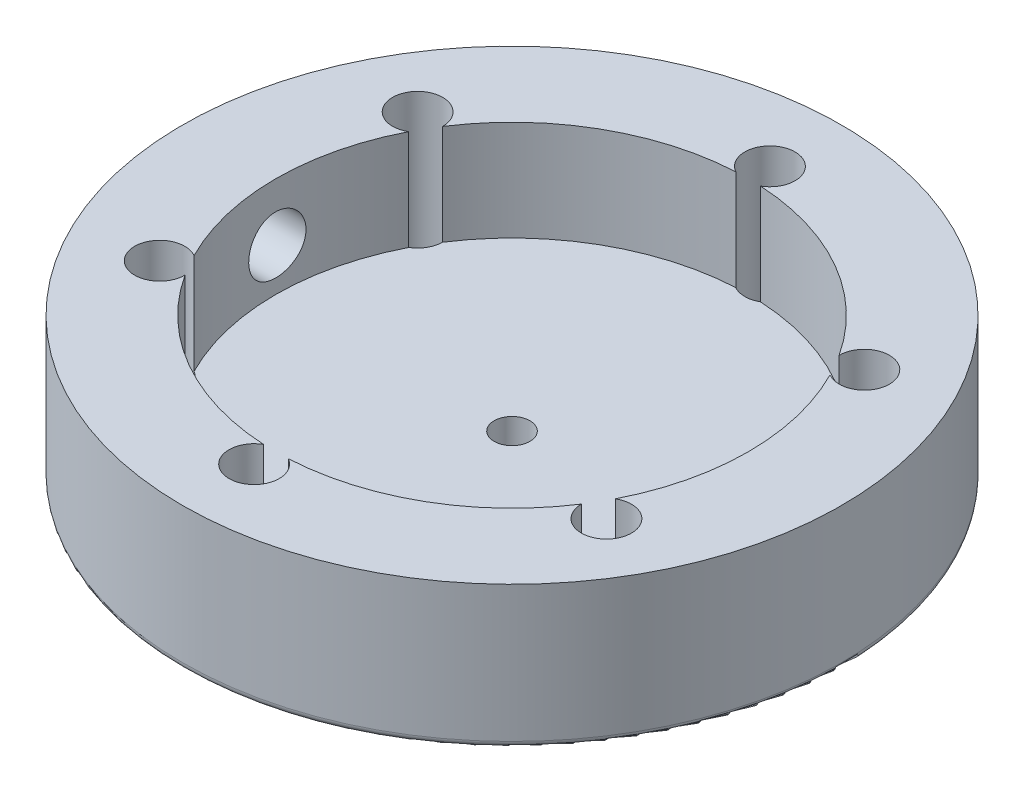
ISO-10303-21;
HEADER;
FILE_DESCRIPTION(('STEP AP214'),'2;1');
FILE_NAME('part.step','',(''),(''),'','','');
FILE_SCHEMA(('AUTOMOTIVE_DESIGN { 1 0 10303 214 1 1 1 1 }'));
ENDSEC;
DATA;
#1=APPLICATION_CONTEXT('core data for automotive mechanical design processes');
#2=APPLICATION_PROTOCOL_DEFINITION('international standard','automotive_design',2000,#1);
#3=PRODUCT_CONTEXT('',#1,'mechanical');
#4=PRODUCT('Part','Part','',(#3));
#5=PRODUCT_RELATED_PRODUCT_CATEGORY('part','',(#4));
#6=PRODUCT_DEFINITION_FORMATION('','',#4);
#7=PRODUCT_DEFINITION_CONTEXT('part definition',#1,'design');
#8=PRODUCT_DEFINITION('design','',#6,#7);
#9=PRODUCT_DEFINITION_SHAPE('','',#8);
#10=(LENGTH_UNIT() NAMED_UNIT(*) SI_UNIT(.MILLI.,.METRE.));
#11=(NAMED_UNIT(*) PLANE_ANGLE_UNIT() SI_UNIT($,.RADIAN.));
#12=(NAMED_UNIT(*) SI_UNIT($,.STERADIAN.) SOLID_ANGLE_UNIT());
#13=UNCERTAINTY_MEASURE_WITH_UNIT(LENGTH_MEASURE(1.E-05),#10,'distance_accuracy_value','');
#14=(GEOMETRIC_REPRESENTATION_CONTEXT(3) GLOBAL_UNCERTAINTY_ASSIGNED_CONTEXT((#13)) GLOBAL_UNIT_ASSIGNED_CONTEXT((#10,
#11,#12)) REPRESENTATION_CONTEXT('',''));
#15=CARTESIAN_POINT('',(0.,0.,0.));
#16=DIRECTION('',(0.,0.,1.));
#17=DIRECTION('',(1.,0.,0.));
#18=AXIS2_PLACEMENT_3D('',#15,#16,#17);
#19=CARTESIAN_POINT('',(0.,20.,0.));
#20=DIRECTION('',(0.,1.,0.));
#21=DIRECTION('',(0.,0.,1.));
#22=AXIS2_PLACEMENT_3D('',#19,#20,#21);
#23=PLANE('',#22);
#24=CARTESIAN_POINT('',(0.,20.,0.));
#25=DIRECTION('',(0.,1.,0.));
#26=DIRECTION('',(0.,0.,1.));
#27=AXIS2_PLACEMENT_3D('',#24,#25,#26);
#28=CIRCLE('',#27,33.);
#29=CARTESIAN_POINT('',(1.72543592967507,20.,32.9548611111105));
#30=VERTEX_POINT('',#29);
#31=CARTESIAN_POINT('',(27.6770289355777,20.,17.9717019032477));
#32=VERTEX_POINT('',#31);
#33=EDGE_CURVE('E150',#30,#32,#28,.T.);
#34=ORIENTED_EDGE('',*,*,#33,.F.);
#35=CARTESIAN_POINT('',(4.4102734525994E-12,20.,36.));
#36=DIRECTION('',(0.,1.,0.));
#37=DIRECTION('',(0.,0.,1.));
#38=AXIS2_PLACEMENT_3D('',#35,#36,#37);
#39=CIRCLE('',#38,3.50000000000354);
#40=CARTESIAN_POINT('',(-1.72543592966699,20.,32.954861111111));
#41=VERTEX_POINT('',#40);
#42=EDGE_CURVE('E165',#41,#30,#39,.T.);
#43=ORIENTED_EDGE('',*,*,#42,.F.);
#44=CARTESIAN_POINT('',(-27.677028935571,20.,17.971701903258));
#45=VERTEX_POINT('',#44);
#46=EDGE_CURVE('E173',#45,#41,#28,.T.);
#47=ORIENTED_EDGE('',*,*,#46,.F.);
#48=CARTESIAN_POINT('',(-31.1769145362365,20.,18.0000000000019));
#49=DIRECTION('',(0.,1.,0.));
#50=DIRECTION('',(0.,0.,1.));
#51=AXIS2_PLACEMENT_3D('',#48,#49,#50);
#52=CIRCLE('',#51,3.50000000000354);
#53=CARTESIAN_POINT('',(-29.4024648652453,20.,14.9831592078579));
#54=VERTEX_POINT('',#53);
#55=EDGE_CURVE('E183',#54,#45,#52,.T.);
#56=ORIENTED_EDGE('',*,*,#55,.F.);
#57=CARTESIAN_POINT('',(-29.4024648652471,20.,-14.9831592078543));
#58=VERTEX_POINT('',#57);
#59=EDGE_CURVE('E411',#58,#54,#28,.T.);
#60=ORIENTED_EDGE('',*,*,#59,.F.);
#61=CARTESIAN_POINT('',(-31.1769145362387,20.,-17.9999999999981));
#62=DIRECTION('',(0.,1.,0.));
#63=DIRECTION('',(0.,0.,1.));
#64=AXIS2_PLACEMENT_3D('',#61,#62,#63);
#65=CIRCLE('',#64,3.50000000000354);
#66=CARTESIAN_POINT('',(-27.6770289355732,20.,-17.9717019032546));
#67=VERTEX_POINT('',#66);
#68=EDGE_CURVE('E195',#67,#58,#65,.T.);
#69=ORIENTED_EDGE('',*,*,#68,.F.);
#70=CARTESIAN_POINT('',(-1.72543592967103,20.,-32.9548611111108));
#71=VERTEX_POINT('',#70);
#72=EDGE_CURVE('E406',#71,#67,#28,.T.);
#73=ORIENTED_EDGE('',*,*,#72,.F.);
#74=CARTESIAN_POINT('',(0.,20.,-36.));
#75=DIRECTION('',(0.,1.,0.));
#76=DIRECTION('',(0.,0.,1.));
#77=AXIS2_PLACEMENT_3D('',#74,#75,#76);
#78=CIRCLE('',#77,3.50000000000354);
#79=CARTESIAN_POINT('',(1.72543592967103,20.,-32.9548611111108));
#80=VERTEX_POINT('',#79);
#81=EDGE_CURVE('E203',#80,#71,#78,.T.);
#82=ORIENTED_EDGE('',*,*,#81,.F.);
#83=CARTESIAN_POINT('',(27.6770289355755,20.,-17.971701903251));
#84=VERTEX_POINT('',#83);
#85=EDGE_CURVE('E395',#84,#80,#28,.T.);
#86=ORIENTED_EDGE('',*,*,#85,.F.);
#87=CARTESIAN_POINT('',(31.1769145362409,20.,-18.0000000000019));
#88=DIRECTION('',(0.,1.,0.));
#89=DIRECTION('',(0.,0.,1.));
#90=AXIS2_PLACEMENT_3D('',#87,#88,#89);
#91=CIRCLE('',#90,3.50000000000354);
#92=CARTESIAN_POINT('',(29.4024648652434,20.,-14.9831592078616));
#93=VERTEX_POINT('',#92);
#94=EDGE_CURVE('E348',#93,#84,#91,.T.);
#95=ORIENTED_EDGE('',*,*,#94,.F.);
#96=CARTESIAN_POINT('',(29.4024648652452,20.,14.983159207858));
#97=VERTEX_POINT('',#96);
#98=EDGE_CURVE('E171',#97,#93,#28,.T.);
#99=ORIENTED_EDGE('',*,*,#98,.F.);
#100=CARTESIAN_POINT('',(31.1769145362431,20.,17.9999999999981));
#101=DIRECTION('',(0.,1.,0.));
#102=DIRECTION('',(0.,0.,1.));
#103=AXIS2_PLACEMENT_3D('',#100,#101,#102);
#104=CIRCLE('',#103,3.50000000000354);
#105=EDGE_CURVE('E168',#32,#97,#104,.T.);
#106=ORIENTED_EDGE('',*,*,#105,.F.);
#107=EDGE_LOOP('',(#34,#43,#47,#56,#60,#69,#73,#82,#86,#95,#99,#106));
#108=FACE_BOUND('',#107,.T.);
#109=CARTESIAN_POINT('',(0.,20.,0.));
#110=DIRECTION('',(0.,1.,0.));
#111=DIRECTION('',(0.,0.,1.));
#112=AXIS2_PLACEMENT_3D('',#109,#110,#111);
#113=CIRCLE('',#112,46.);
#114=CARTESIAN_POINT('',(0.,20.,46.));
#115=VERTEX_POINT('',#114);
#116=EDGE_CURVE('E207',#115,#115,#113,.T.);
#117=ORIENTED_EDGE('',*,*,#116,.T.);
#118=EDGE_LOOP('',(#117));
#119=FACE_BOUND('',#118,.T.);
#120=ADVANCED_FACE('F49',(#108,#119),#23,.T.);
#121=CARTESIAN_POINT('',(0.,0.,0.));
#122=DIRECTION('',(0.,1.,0.));
#123=DIRECTION('',(0.,0.,1.));
#124=AXIS2_PLACEMENT_3D('',#121,#122,#123);
#125=PLANE('',#124);
#126=CARTESIAN_POINT('',(0.,0.,0.));
#127=DIRECTION('',(0.,1.,0.));
#128=DIRECTION('',(0.,0.,1.));
#129=AXIS2_PLACEMENT_3D('',#126,#127,#128);
#130=CIRCLE('',#129,12.);
#131=CARTESIAN_POINT('',(0.,0.,12.));
#132=VERTEX_POINT('',#131);
#133=EDGE_CURVE('E232',#132,#132,#130,.F.);
#134=ORIENTED_EDGE('',*,*,#133,.F.);
#135=EDGE_LOOP('',(#134));
#136=FACE_BOUND('',#135,.T.);
#137=CARTESIAN_POINT('',(0.,0.,0.));
#138=DIRECTION('',(0.,1.,0.));
#139=DIRECTION('',(0.,0.,1.));
#140=AXIS2_PLACEMENT_3D('',#137,#138,#139);
#141=CIRCLE('',#140,45.);
#142=CARTESIAN_POINT('',(0.,0.,45.));
#143=VERTEX_POINT('',#142);
#144=EDGE_CURVE('E228',#143,#143,#141,.F.);
#145=ORIENTED_EDGE('',*,*,#144,.T.);
#146=EDGE_LOOP('',(#145));
#147=FACE_BOUND('',#146,.T.);
#148=CARTESIAN_POINT('',(0.,0.,-36.));
#149=DIRECTION('',(0.,1.,0.));
#150=DIRECTION('',(0.,0.,1.));
#151=AXIS2_PLACEMENT_3D('',#148,#149,#150);
#152=CIRCLE('',#151,3.50000000000354);
#153=CARTESIAN_POINT('',(0.,0.,-32.4999999999965));
#154=VERTEX_POINT('',#153);
#155=EDGE_CURVE('E199',#154,#154,#152,.T.);
#156=ORIENTED_EDGE('',*,*,#155,.T.);
#157=EDGE_LOOP('',(#156));
#158=FACE_BOUND('',#157,.T.);
#159=CARTESIAN_POINT('',(-31.1769145362387,0.,-17.9999999999981));
#160=DIRECTION('',(0.,1.,0.));
#161=DIRECTION('',(0.,0.,1.));
#162=AXIS2_PLACEMENT_3D('',#159,#160,#161);
#163=CIRCLE('',#162,3.50000000000354);
#164=CARTESIAN_POINT('',(-31.1769145362387,0.,-14.4999999999945));
#165=VERTEX_POINT('',#164);
#166=EDGE_CURVE('E193',#165,#165,#163,.T.);
#167=ORIENTED_EDGE('',*,*,#166,.T.);
#168=EDGE_LOOP('',(#167));
#169=FACE_BOUND('',#168,.T.);
#170=CARTESIAN_POINT('',(-31.1769145362365,0.,18.0000000000019));
#171=DIRECTION('',(0.,1.,0.));
#172=DIRECTION('',(0.,0.,1.));
#173=AXIS2_PLACEMENT_3D('',#170,#171,#172);
#174=CIRCLE('',#173,3.50000000000354);
#175=CARTESIAN_POINT('',(-31.1769145362365,0.,21.5000000000054));
#176=VERTEX_POINT('',#175);
#177=EDGE_CURVE('E177',#176,#176,#174,.T.);
#178=ORIENTED_EDGE('',*,*,#177,.T.);
#179=EDGE_LOOP('',(#178));
#180=FACE_BOUND('',#179,.T.);
#181=CARTESIAN_POINT('',(4.4102734525994E-12,0.,36.));
#182=DIRECTION('',(0.,1.,0.));
#183=DIRECTION('',(0.,0.,1.));
#184=AXIS2_PLACEMENT_3D('',#181,#182,#183);
#185=CIRCLE('',#184,3.50000000000354);
#186=CARTESIAN_POINT('',(4.4102734525994E-12,0.,39.5000000000035));
#187=VERTEX_POINT('',#186);
#188=EDGE_CURVE('E178',#187,#187,#185,.T.);
#189=ORIENTED_EDGE('',*,*,#188,.T.);
#190=EDGE_LOOP('',(#189));
#191=FACE_BOUND('',#190,.T.);
#192=CARTESIAN_POINT('',(31.1769145362431,0.,17.9999999999981));
#193=DIRECTION('',(0.,1.,0.));
#194=DIRECTION('',(0.,0.,1.));
#195=AXIS2_PLACEMENT_3D('',#192,#193,#194);
#196=CIRCLE('',#195,3.50000000000354);
#197=CARTESIAN_POINT('',(31.1769145362431,0.,21.5000000000016));
#198=VERTEX_POINT('',#197);
#199=EDGE_CURVE('E188',#198,#198,#196,.T.);
#200=ORIENTED_EDGE('',*,*,#199,.T.);
#201=EDGE_LOOP('',(#200));
#202=FACE_BOUND('',#201,.T.);
#203=CARTESIAN_POINT('',(31.1769145362409,0.,-18.0000000000019));
#204=DIRECTION('',(0.,1.,0.));
#205=DIRECTION('',(0.,0.,1.));
#206=AXIS2_PLACEMENT_3D('',#203,#204,#205);
#207=CIRCLE('',#206,3.50000000000354);
#208=CARTESIAN_POINT('',(31.1769145362409,0.,-14.4999999999983));
#209=VERTEX_POINT('',#208);
#210=EDGE_CURVE('E345',#209,#209,#207,.T.);
#211=ORIENTED_EDGE('',*,*,#210,.T.);
#212=EDGE_LOOP('',(#211));
#213=FACE_BOUND('',#212,.T.);
#214=ADVANCED_FACE('F255',(#136,#147,#158,#169,#180,#191,#202,#213),#125,.F.);
#215=CARTESIAN_POINT('',(0.,20.,0.));
#216=DIRECTION('',(0.,-1.,0.));
#217=DIRECTION('',(0.,0.,-1.));
#218=AXIS2_PLACEMENT_3D('',#215,#216,#217);
#219=CYLINDRICAL_SURFACE('',#218,46.);
#220=CARTESIAN_POINT('',(-46.,8.,0.));
#221=CARTESIAN_POINT('',(-45.9999977285705,8.00000977767558,-0.224227383894109));
#222=CARTESIAN_POINT('',(-45.9983430362557,8.01891765184624,-0.448606525183141));
#223=CARTESIAN_POINT('',(-45.9919012379841,8.094065072974,-0.891154156323271));
#224=CARTESIAN_POINT('',(-45.9871106030481,8.15034667884991,-1.10931535995352));
#225=CARTESIAN_POINT('',(-45.9749381658736,8.29859949987995,-1.53295378380859));
#226=CARTESIAN_POINT('',(-45.9675578500262,8.39055024531742,-1.73843820070689));
#227=CARTESIAN_POINT('',(-45.9510332255131,8.60749393271544,-2.13100809888229));
#228=CARTESIAN_POINT('',(-45.9418892889027,8.73247990758485,-2.31809744825638));
#229=CARTESIAN_POINT('',(-45.9228348976703,9.01231828018449,-2.66913129878992));
#230=CARTESIAN_POINT('',(-45.9129226200477,9.16724309709402,-2.83301797480505));
#231=CARTESIAN_POINT('',(-45.8934639727461,9.50240802458864,-3.13249799915954));
#232=CARTESIAN_POINT('',(-45.883917619324,9.68264925824924,-3.26809009164363));
#233=CARTESIAN_POINT('',(-45.8662523263715,10.0636835035146,-3.50732983244712));
#234=CARTESIAN_POINT('',(-45.8581356821084,10.2645087579517,-3.61092631199781));
#235=CARTESIAN_POINT('',(-45.8442700926442,10.6807858851978,-3.78290727978104));
#236=CARTESIAN_POINT('',(-45.8385211022726,10.8962374788706,-3.85129243978993));
#237=CARTESIAN_POINT('',(-45.830057344427,11.3350695327786,-3.95074097738121));
#238=CARTESIAN_POINT('',(-45.8273348860433,11.5584284003936,-3.98189897039565));
#239=CARTESIAN_POINT('',(-45.8252082353394,12.0072209075973,-4.00630104440279));
#240=CARTESIAN_POINT('',(-45.8258039757165,12.2326545050118,-3.99954589438519));
#241=CARTESIAN_POINT('',(-45.8302394140666,12.678548074925,-3.9483915880778));
#242=CARTESIAN_POINT('',(-45.8340702424775,12.8990199557931,-3.90409535607296));
#243=CARTESIAN_POINT('',(-45.8445303189289,13.3293877323079,-3.77927624600677));
#244=CARTESIAN_POINT('',(-45.8511595964273,13.539283516599,-3.69875298659972));
#245=CARTESIAN_POINT('',(-45.866479827065,13.9428683504883,-3.50365067255338));
#246=CARTESIAN_POINT('',(-45.8751735661868,14.136535016963,-3.38902554426596));
#247=CARTESIAN_POINT('',(-45.8936406284605,14.5019193213975,-3.12900647092458));
#248=CARTESIAN_POINT('',(-45.9034139754438,14.6736364746627,-2.98361184659911));
#249=CARTESIAN_POINT('',(-45.9229785147518,14.9908457111766,-2.66560421524801));
#250=CARTESIAN_POINT('',(-45.9327696582409,15.1362486274573,-2.4929022472207));
#251=CARTESIAN_POINT('',(-45.95123564835,15.3960121724796,-2.12549237013378));
#252=CARTESIAN_POINT('',(-45.959910494134,15.5103727779739,-1.93078444459427));
#253=CARTESIAN_POINT('',(-45.9751683502548,15.704800271593,-1.52483096588586));
#254=CARTESIAN_POINT('',(-45.9817511125928,15.7848630943976,-1.31358345578604));
#255=CARTESIAN_POINT('',(-45.9920803344126,15.9083593146094,-0.880574461427621));
#256=CARTESIAN_POINT('',(-45.995826857993,15.9517935398213,-0.658813214898609));
#257=CARTESIAN_POINT('',(-46.0000532442106,16.0006875643246,-0.211844479152889));
#258=CARTESIAN_POINT('',(-46.0005436994455,16.006270502174,0.0133494440173132));
#259=CARTESIAN_POINT('',(-45.9982310016282,15.9796262226001,0.461469996673726));
#260=CARTESIAN_POINT('',(-45.9954278820702,15.9473993896855,0.684396649193821));
#261=CARTESIAN_POINT('',(-45.9868500316988,15.8461524512686,1.12130261089924));
#262=CARTESIAN_POINT('',(-45.9810799206281,15.777189539549,1.33529527230571));
#263=CARTESIAN_POINT('',(-45.967216103292,15.6044865363973,1.74867267660003));
#264=CARTESIAN_POINT('',(-45.9591223571432,15.5007458480247,1.9480571686755));
#265=CARTESIAN_POINT('',(-45.9414917704405,15.261123482931,2.32711808841676));
#266=CARTESIAN_POINT('',(-45.9319512956969,15.1251603650181,2.50674286157891));
#267=CARTESIAN_POINT('',(-45.9125109361372,14.8250701030327,2.84066374135941));
#268=CARTESIAN_POINT('',(-45.9026110445232,14.6609424260434,2.99495936860324));
#269=CARTESIAN_POINT('',(-45.8835361672919,14.3086470829359,3.27426550151284));
#270=CARTESIAN_POINT('',(-45.8743632176725,14.1204155095944,3.39919555788599));
#271=CARTESIAN_POINT('',(-45.8578101371487,13.7255730943939,3.61567234236894));
#272=CARTESIAN_POINT('',(-45.8504299869865,13.5189624499909,3.70721942907557));
#273=CARTESIAN_POINT('',(-45.8383098416306,13.0935098563504,3.85419502490979));
#274=CARTESIAN_POINT('',(-45.8335662683104,12.8746849295276,3.90967250193944));
#275=CARTESIAN_POINT('',(-45.8272445862578,12.4307829664595,3.98309339935581));
#276=CARTESIAN_POINT('',(-45.825666410717,12.2057060622693,4.00103761191455));
#277=CARTESIAN_POINT('',(-45.8258552825946,11.7564887632843,3.99887309501891));
#278=CARTESIAN_POINT('',(-45.8276112185648,11.5323477439755,3.97889076180226));
#279=CARTESIAN_POINT('',(-45.834246839158,11.0906182985963,3.90170423350695));
#280=CARTESIAN_POINT('',(-45.8391265283207,10.8730298820492,3.84449998433456));
#281=CARTESIAN_POINT('',(-45.8514568827458,10.4505758540243,3.69452606310881));
#282=CARTESIAN_POINT('',(-45.8589073615243,10.2457093209789,3.60175897071239));
#283=CARTESIAN_POINT('',(-45.8755401471554,9.85443688157736,3.38330655214035));
#284=CARTESIAN_POINT('',(-45.8847224303796,9.66803072340355,3.25762167508082));
#285=CARTESIAN_POINT('',(-45.9038206784499,9.31832322639036,2.97642627183586));
#286=CARTESIAN_POINT('',(-45.9137388879215,9.15509740320764,2.82082198308656));
#287=CARTESIAN_POINT('',(-45.93317092391,8.85701131433314,2.48437904881076));
#288=CARTESIAN_POINT('',(-45.9426846522082,8.72215790716712,2.303534319391));
#289=CARTESIAN_POINT('',(-45.9602544666636,8.48444685001922,1.92136583977714));
#290=CARTESIAN_POINT('',(-45.9683076119567,8.38165345959633,1.72000201971635));
#291=CARTESIAN_POINT('',(-45.9820150223571,8.21146917389082,1.30293824908928));
#292=CARTESIAN_POINT('',(-45.9876720328809,8.1440377407665,1.08725503492918));
#293=CARTESIAN_POINT('',(-45.994503746574,8.06359259940161,0.725257992711595));
#294=CARTESIAN_POINT('',(-45.9965554127388,8.03977724903366,0.581269530602108));
#295=CARTESIAN_POINT('',(-45.9993042759584,8.00797779362126,0.29154209763215));
#296=CARTESIAN_POINT('',(-46.0000014769897,7.99999364209805,0.145803131912243));
#297=CARTESIAN_POINT('',(-46.,8.,0.));
#298=B_SPLINE_CURVE_WITH_KNOTS('',3,(#220,#221,#222,#223,#224,#225,#226,#227,#228,#229,#230,
#231,#232,#233,#234,#235,#236,#237,#238,#239,#240,#241,#242,#243,#244,#245,#246,#247,#248,#249,
#250,#251,#252,#253,#254,#255,#256,#257,#258,#259,#260,#261,#262,#263,#264,#265,#266,#267,#268,
#269,#270,#271,#272,#273,#274,#275,#276,#277,#278,#279,#280,#281,#282,#283,#284,#285,#286,#287,
#288,#289,#290,#291,#292,#293,#294,#295,#296,#297),.UNSPECIFIED.,.T.,.F.,(4,2,2,2,2,2,2,2,2,2,2,
2,2,2,2,2,2,2,2,2,2,2,2,2,2,2,2,2,2,2,2,2,2,2,2,2,2,2,4),(0.,0.672149795371174,1.34505728632151,
2.01757918073403,2.68995935408334,3.36398678235651,4.03804412098098,4.71317392514569,
5.38829084842312,6.06168824011353,6.73507197338011,7.40661547829384,8.07816605241074,
8.75062808366532,9.42310496183092,10.0978195498406,10.7725346431367,11.4473296883784,
12.1221094828746,12.7946930125715,13.4672697024505,14.1388023163357,14.8103464572807,
15.4836063550193,16.1568789932759,16.8319751599037,17.507064074496,18.1812345677475,
18.855390831904,19.5273043074988,20.1992187595716,20.8710844815444,21.5429410373477,
22.2169384480893,22.8910985989687,23.5666014469276,24.2413282173606,24.6783927333046,
25.11545596607),.UNSPECIFIED.);
#299=CARTESIAN_POINT('',(-46.,8.,0.));
#300=VERTEX_POINT('',#299);
#301=EDGE_CURVE('E272',#300,#300,#298,.T.);
#302=ORIENTED_EDGE('',*,*,#301,.T.);
#303=EDGE_LOOP('',(#302));
#304=FACE_BOUND('',#303,.T.);
#305=CARTESIAN_POINT('',(0.,1.,0.));
#306=DIRECTION('',(0.,1.,0.));
#307=DIRECTION('',(0.,0.,1.));
#308=AXIS2_PLACEMENT_3D('',#305,#306,#307);
#309=CIRCLE('',#308,46.);
#310=CARTESIAN_POINT('',(0.,1.,46.));
#311=VERTEX_POINT('',#310);
#312=EDGE_CURVE('E224',#311,#311,#309,.T.);
#313=ORIENTED_EDGE('',*,*,#312,.T.);
#314=EDGE_LOOP('',(#313));
#315=FACE_BOUND('',#314,.T.);
#316=ORIENTED_EDGE('',*,*,#116,.F.);
#317=EDGE_LOOP('',(#316));
#318=FACE_BOUND('',#317,.T.);
#319=ADVANCED_FACE('F260',(#304,#315,#318),#219,.T.);
#320=CARTESIAN_POINT('',(0.,20.,-36.));
#321=DIRECTION('',(0.,-1.,0.));
#322=DIRECTION('',(0.,0.,-1.));
#323=AXIS2_PLACEMENT_3D('',#320,#321,#322);
#324=CYLINDRICAL_SURFACE('',#323,3.50000000000354);
#325=DIRECTION('',(0.,1.,0.));
#326=VECTOR('',#325,1.);
#327=CARTESIAN_POINT('',(-1.72543592967089,13.,-32.9548611111108));
#328=LINE('',#327,#326);
#329=CARTESIAN_POINT('',(-1.72543592967103,6.,-32.9548611111108));
#330=VERTEX_POINT('',#329);
#331=EDGE_CURVE('E349',#330,#71,#328,.T.);
#332=ORIENTED_EDGE('',*,*,#331,.F.);
#333=CARTESIAN_POINT('',(0.,6.,-36.));
#334=DIRECTION('',(0.,1.,0.));
#335=DIRECTION('',(0.,0.,1.));
#336=AXIS2_PLACEMENT_3D('',#333,#334,#335);
#337=CIRCLE('',#336,3.50000000000354);
#338=CARTESIAN_POINT('',(1.72543592967103,6.,-32.9548611111108));
#339=VERTEX_POINT('',#338);
#340=EDGE_CURVE('E366',#330,#339,#337,.T.);
#341=ORIENTED_EDGE('',*,*,#340,.T.);
#342=DIRECTION('',(0.,1.,0.));
#343=VECTOR('',#342,1.);
#344=CARTESIAN_POINT('',(1.72543592967089,13.,-32.9548611111108));
#345=LINE('',#344,#343);
#346=EDGE_CURVE('E355',#80,#339,#345,.F.);
#347=ORIENTED_EDGE('',*,*,#346,.F.);
#348=ORIENTED_EDGE('',*,*,#81,.T.);
#349=EDGE_LOOP('',(#332,#341,#347,#348));
#350=FACE_BOUND('',#349,.T.);
#351=ORIENTED_EDGE('',*,*,#155,.F.);
#352=EDGE_LOOP('',(#351));
#353=FACE_BOUND('',#352,.T.);
#354=ADVANCED_FACE('F264',(#350,#353),#324,.F.);
#355=CARTESIAN_POINT('',(-31.1769145362387,20.,-17.9999999999981));
#356=DIRECTION('',(0.,-1.,0.));
#357=DIRECTION('',(0.,0.,-1.));
#358=AXIS2_PLACEMENT_3D('',#355,#356,#357);
#359=CYLINDRICAL_SURFACE('',#358,3.50000000000354);
#360=DIRECTION('',(0.,1.,0.));
#361=VECTOR('',#360,1.);
#362=CARTESIAN_POINT('',(-29.4024648652471,13.,-14.9831592078543));
#363=LINE('',#362,#361);
#364=CARTESIAN_POINT('',(-29.4024648652471,6.,-14.9831592078543));
#365=VERTEX_POINT('',#364);
#366=EDGE_CURVE('E332',#365,#58,#363,.T.);
#367=ORIENTED_EDGE('',*,*,#366,.F.);
#368=CARTESIAN_POINT('',(-31.1769145362387,6.,-17.9999999999981));
#369=DIRECTION('',(0.,1.,0.));
#370=DIRECTION('',(0.,0.,1.));
#371=AXIS2_PLACEMENT_3D('',#368,#369,#370);
#372=CIRCLE('',#371,3.50000000000354);
#373=CARTESIAN_POINT('',(-27.6770289355732,6.,-17.9717019032546));
#374=VERTEX_POINT('',#373);
#375=EDGE_CURVE('E372',#365,#374,#372,.T.);
#376=ORIENTED_EDGE('',*,*,#375,.T.);
#377=DIRECTION('',(0.,1.,0.));
#378=VECTOR('',#377,1.);
#379=CARTESIAN_POINT('',(-27.6770289355732,13.,-17.9717019032546));
#380=LINE('',#379,#378);
#381=EDGE_CURVE('E383',#67,#374,#380,.F.);
#382=ORIENTED_EDGE('',*,*,#381,.F.);
#383=ORIENTED_EDGE('',*,*,#68,.T.);
#384=EDGE_LOOP('',(#367,#376,#382,#383));
#385=FACE_BOUND('',#384,.T.);
#386=ORIENTED_EDGE('',*,*,#166,.F.);
#387=EDGE_LOOP('',(#386));
#388=FACE_BOUND('',#387,.T.);
#389=ADVANCED_FACE('F321',(#385,#388),#359,.F.);
#390=CARTESIAN_POINT('',(-31.1769145362365,20.,18.0000000000019));
#391=DIRECTION('',(0.,-1.,0.));
#392=DIRECTION('',(0.,0.,-1.));
#393=AXIS2_PLACEMENT_3D('',#390,#391,#392);
#394=CYLINDRICAL_SURFACE('',#393,3.50000000000354);
#395=DIRECTION('',(0.,1.,0.));
#396=VECTOR('',#395,1.);
#397=CARTESIAN_POINT('',(-27.677028935571,13.,17.9717019032579));
#398=LINE('',#397,#396);
#399=CARTESIAN_POINT('',(-27.677028935571,6.,17.971701903258));
#400=VERTEX_POINT('',#399);
#401=EDGE_CURVE('E380',#400,#45,#398,.T.);
#402=ORIENTED_EDGE('',*,*,#401,.F.);
#403=CARTESIAN_POINT('',(-31.1769145362365,6.,18.0000000000019));
#404=DIRECTION('',(0.,1.,0.));
#405=DIRECTION('',(0.,0.,1.));
#406=AXIS2_PLACEMENT_3D('',#403,#404,#405);
#407=CIRCLE('',#406,3.50000000000354);
#408=CARTESIAN_POINT('',(-29.4024648652453,6.,14.9831592078579));
#409=VERTEX_POINT('',#408);
#410=EDGE_CURVE('E421',#400,#409,#407,.T.);
#411=ORIENTED_EDGE('',*,*,#410,.T.);
#412=DIRECTION('',(0.,1.,0.));
#413=VECTOR('',#412,1.);
#414=CARTESIAN_POINT('',(-29.4024648652453,13.,14.9831592078579));
#415=LINE('',#414,#413);
#416=EDGE_CURVE('E158',#54,#409,#415,.F.);
#417=ORIENTED_EDGE('',*,*,#416,.F.);
#418=ORIENTED_EDGE('',*,*,#55,.T.);
#419=EDGE_LOOP('',(#402,#411,#417,#418));
#420=FACE_BOUND('',#419,.T.);
#421=ORIENTED_EDGE('',*,*,#177,.F.);
#422=EDGE_LOOP('',(#421));
#423=FACE_BOUND('',#422,.T.);
#424=ADVANCED_FACE('F319',(#420,#423),#394,.F.);
#425=CARTESIAN_POINT('',(4.4102734525994E-12,20.,36.));
#426=DIRECTION('',(0.,-1.,0.));
#427=DIRECTION('',(0.,0.,-1.));
#428=AXIS2_PLACEMENT_3D('',#425,#426,#427);
#429=CYLINDRICAL_SURFACE('',#428,3.50000000000354);
#430=DIRECTION('',(0.,1.,0.));
#431=VECTOR('',#430,1.);
#432=CARTESIAN_POINT('',(1.72543592967493,13.,32.9548611111106));
#433=LINE('',#432,#431);
#434=CARTESIAN_POINT('',(1.72543592967507,6.,32.9548611111105));
#435=VERTEX_POINT('',#434);
#436=EDGE_CURVE('E147',#435,#30,#433,.T.);
#437=ORIENTED_EDGE('',*,*,#436,.F.);
#438=CARTESIAN_POINT('',(4.4102734525994E-12,6.,36.));
#439=DIRECTION('',(0.,1.,0.));
#440=DIRECTION('',(0.,0.,1.));
#441=AXIS2_PLACEMENT_3D('',#438,#439,#440);
#442=CIRCLE('',#441,3.50000000000354);
#443=CARTESIAN_POINT('',(-1.72543592966699,6.,32.954861111111));
#444=VERTEX_POINT('',#443);
#445=EDGE_CURVE('E418',#435,#444,#442,.T.);
#446=ORIENTED_EDGE('',*,*,#445,.T.);
#447=DIRECTION('',(0.,1.,0.));
#448=VECTOR('',#447,1.);
#449=CARTESIAN_POINT('',(-1.72543592966685,13.,32.954861111111));
#450=LINE('',#449,#448);
#451=EDGE_CURVE('E80',#41,#444,#450,.F.);
#452=ORIENTED_EDGE('',*,*,#451,.F.);
#453=ORIENTED_EDGE('',*,*,#42,.T.);
#454=EDGE_LOOP('',(#437,#446,#452,#453));
#455=FACE_BOUND('',#454,.T.);
#456=ORIENTED_EDGE('',*,*,#188,.F.);
#457=EDGE_LOOP('',(#456));
#458=FACE_BOUND('',#457,.T.);
#459=ADVANCED_FACE('F174',(#455,#458),#429,.F.);
#460=CARTESIAN_POINT('',(31.1769145362431,20.,17.9999999999981));
#461=DIRECTION('',(0.,-1.,0.));
#462=DIRECTION('',(0.,0.,-1.));
#463=AXIS2_PLACEMENT_3D('',#460,#461,#462);
#464=CYLINDRICAL_SURFACE('',#463,3.50000000000354);
#465=DIRECTION('',(0.,1.,0.));
#466=VECTOR('',#465,1.);
#467=CARTESIAN_POINT('',(29.4024648652452,13.,14.983159207858));
#468=LINE('',#467,#466);
#469=CARTESIAN_POINT('',(29.4024648652452,6.,14.983159207858));
#470=VERTEX_POINT('',#469);
#471=EDGE_CURVE('E362',#470,#97,#468,.T.);
#472=ORIENTED_EDGE('',*,*,#471,.F.);
#473=CARTESIAN_POINT('',(31.1769145362431,6.,17.9999999999981));
#474=DIRECTION('',(0.,1.,0.));
#475=DIRECTION('',(0.,0.,1.));
#476=AXIS2_PLACEMENT_3D('',#473,#474,#475);
#477=CIRCLE('',#476,3.50000000000354);
#478=CARTESIAN_POINT('',(27.6770289355777,6.,17.9717019032477));
#479=VERTEX_POINT('',#478);
#480=EDGE_CURVE('E364',#470,#479,#477,.T.);
#481=ORIENTED_EDGE('',*,*,#480,.T.);
#482=DIRECTION('',(0.,1.,0.));
#483=VECTOR('',#482,1.);
#484=CARTESIAN_POINT('',(27.6770289355777,13.,17.9717019032477));
#485=LINE('',#484,#483);
#486=EDGE_CURVE('E363',#32,#479,#485,.F.);
#487=ORIENTED_EDGE('',*,*,#486,.F.);
#488=ORIENTED_EDGE('',*,*,#105,.T.);
#489=EDGE_LOOP('',(#472,#481,#487,#488));
#490=FACE_BOUND('',#489,.T.);
#491=ORIENTED_EDGE('',*,*,#199,.F.);
#492=EDGE_LOOP('',(#491));
#493=FACE_BOUND('',#492,.T.);
#494=ADVANCED_FACE('F312',(#490,#493),#464,.F.);
#495=CARTESIAN_POINT('',(31.1769145362409,20.,-18.0000000000019));
#496=DIRECTION('',(0.,-1.,0.));
#497=DIRECTION('',(0.,0.,-1.));
#498=AXIS2_PLACEMENT_3D('',#495,#496,#497);
#499=CYLINDRICAL_SURFACE('',#498,3.50000000000354);
#500=DIRECTION('',(0.,1.,0.));
#501=VECTOR('',#500,1.);
#502=CARTESIAN_POINT('',(27.6770289355755,13.,-17.971701903251));
#503=LINE('',#502,#501);
#504=CARTESIAN_POINT('',(27.6770289355755,6.,-17.971701903251));
#505=VERTEX_POINT('',#504);
#506=EDGE_CURVE('E221',#505,#84,#503,.T.);
#507=ORIENTED_EDGE('',*,*,#506,.F.);
#508=CARTESIAN_POINT('',(31.1769145362409,6.,-18.0000000000019));
#509=DIRECTION('',(0.,1.,0.));
#510=DIRECTION('',(0.,0.,1.));
#511=AXIS2_PLACEMENT_3D('',#508,#509,#510);
#512=CIRCLE('',#511,3.50000000000354);
#513=CARTESIAN_POINT('',(29.4024648652434,6.,-14.9831592078616));
#514=VERTEX_POINT('',#513);
#515=EDGE_CURVE('E214',#505,#514,#512,.T.);
#516=ORIENTED_EDGE('',*,*,#515,.T.);
#517=DIRECTION('',(0.,1.,0.));
#518=VECTOR('',#517,1.);
#519=CARTESIAN_POINT('',(29.4024648652434,13.,-14.9831592078616));
#520=LINE('',#519,#518);
#521=EDGE_CURVE('E218',#93,#514,#520,.F.);
#522=ORIENTED_EDGE('',*,*,#521,.F.);
#523=ORIENTED_EDGE('',*,*,#94,.T.);
#524=EDGE_LOOP('',(#507,#516,#522,#523));
#525=FACE_BOUND('',#524,.T.);
#526=ORIENTED_EDGE('',*,*,#210,.F.);
#527=EDGE_LOOP('',(#526));
#528=FACE_BOUND('',#527,.T.);
#529=ADVANCED_FACE('F309',(#525,#528),#499,.F.);
#530=CARTESIAN_POINT('',(0.,6.,0.));
#531=DIRECTION('',(0.,1.,0.));
#532=DIRECTION('',(0.,0.,1.));
#533=AXIS2_PLACEMENT_3D('',#530,#531,#532);
#534=CYLINDRICAL_SURFACE('',#533,33.);
#535=ORIENTED_EDGE('',*,*,#331,.T.);
#536=ORIENTED_EDGE('',*,*,#72,.T.);
#537=ORIENTED_EDGE('',*,*,#381,.T.);
#538=CARTESIAN_POINT('',(0.,6.,0.));
#539=DIRECTION('',(0.,1.,0.));
#540=DIRECTION('',(0.,0.,1.));
#541=AXIS2_PLACEMENT_3D('',#538,#539,#540);
#542=CIRCLE('',#541,33.);
#543=EDGE_CURVE('E400',#330,#374,#542,.T.);
#544=ORIENTED_EDGE('',*,*,#543,.F.);
#545=EDGE_LOOP('',(#535,#536,#537,#544));
#546=FACE_BOUND('',#545,.T.);
#547=ADVANCED_FACE('F308',(#546),#534,.F.);
#548=CARTESIAN_POINT('',(-32.7566787083184,12.,-4.));
#549=CARTESIAN_POINT('',(-32.7566818366577,11.7762055034807,-3.99999045298508));
#550=CARTESIAN_POINT('',(-32.7589969177124,11.5522697896419,-3.98115515343243));
#551=CARTESIAN_POINT('',(-32.7680039727008,11.110626634477,-3.90631302023377));
#552=CARTESIAN_POINT('',(-32.7747005616006,10.8929260131031,-3.85026699225597));
#553=CARTESIAN_POINT('',(-32.7917012296198,10.4702114858093,-3.70267655289125));
#554=CARTESIAN_POINT('',(-32.8020029032309,10.2651892272727,-3.61115580778966));
#555=CARTESIAN_POINT('',(-32.8250500965597,9.87345279800498,-3.39526371924446));
#556=CARTESIAN_POINT('',(-32.8377951872424,9.68673542184091,-3.27089814151645));
#557=CARTESIAN_POINT('',(-32.864368406131,9.33588554601347,-2.99214417405283));
#558=CARTESIAN_POINT('',(-32.8782013482531,9.17186345073592,-2.83761726919589));
#559=CARTESIAN_POINT('',(-32.905348295857,8.87201333478101,-2.50322501027308));
#560=CARTESIAN_POINT('',(-32.9186622758482,8.73618669760225,-2.32335841356232));
#561=CARTESIAN_POINT('',(-32.9433202079721,8.49618911358668,-1.94270104483964));
#562=CARTESIAN_POINT('',(-32.9546579142429,8.39211777612165,-1.74184703190994));
#563=CARTESIAN_POINT('',(-32.9740330113373,8.21922286326735,-1.325352481192));
#564=CARTESIAN_POINT('',(-32.9820705176523,8.15039805439581,-1.10971246115218));
#565=CARTESIAN_POINT('',(-32.993905717215,8.05027889992132,-0.670894532630864));
#566=CARTESIAN_POINT('',(-32.9977241084167,8.0188012813973,-0.447759006205903));
#567=CARTESIAN_POINT('',(-33.0007614848467,7.99370220196665,0.000657902440336398));
#568=CARTESIAN_POINT('',(-32.9999806408196,8.00007933571949,0.225939204690659));
#569=CARTESIAN_POINT('',(-32.9939243045577,8.05036154861505,0.671006287963217));
#570=CARTESIAN_POINT('',(-32.9886724189773,8.09406952855121,0.890814702972183));
#571=CARTESIAN_POINT('',(-32.974290708158,8.2174647919492,1.31995337515371));
#572=CARTESIAN_POINT('',(-32.9651608129403,8.2971527246728,1.52928344316775));
#573=CARTESIAN_POINT('',(-32.9440083562255,8.49045652019151,1.93213533023985));
#574=CARTESIAN_POINT('',(-32.931978510434,8.60415799663609,2.12561567058178));
#575=CARTESIAN_POINT('',(-32.9063727008439,8.86219905355329,2.49082341217299));
#576=CARTESIAN_POINT('',(-32.8927966703688,9.00653995552618,2.66254987465172));
#577=CARTESIAN_POINT('',(-32.8655155228159,9.32286724018325,2.98053255244169));
#578=CARTESIAN_POINT('',(-32.8518101368879,9.49502534583268,3.12661796887099));
#579=CARTESIAN_POINT('',(-32.8259012315593,9.86150929373647,3.38784512845958));
#580=CARTESIAN_POINT('',(-32.8136977163744,10.0558351982126,3.50298678476122));
#581=CARTESIAN_POINT('',(-32.7921742461928,10.4612872652783,3.69906598308285));
#582=CARTESIAN_POINT('',(-32.7828554012633,10.6724198561563,3.77999036212115));
#583=CARTESIAN_POINT('',(-32.7681782798095,11.1054153047808,3.90518910413138));
#584=CARTESIAN_POINT('',(-32.762819824179,11.3272776767954,3.94946512451534));
#585=CARTESIAN_POINT('',(-32.7567026814491,11.7739278468144,3.99988519584663));
#586=CARTESIAN_POINT('',(-32.7559150285832,11.9986881561439,4.00626937814872));
#587=CARTESIAN_POINT('',(-32.7589520971464,12.4460751506793,3.98135765376567));
#588=CARTESIAN_POINT('',(-32.7627767262732,12.6687018784931,3.95006250113017));
#589=CARTESIAN_POINT('',(-32.7745810041736,13.1047858001424,3.85088243715065));
#590=CARTESIAN_POINT('',(-32.7825474977128,13.3182697228316,3.78311334910617));
#591=CARTESIAN_POINT('',(-32.8017272208065,13.7308433110953,3.6130281927127));
#592=CARTESIAN_POINT('',(-32.8129405579643,13.9299324993412,3.51071097938724));
#593=CARTESIAN_POINT('',(-32.8374200222184,14.3091529822973,3.27384173326402));
#594=CARTESIAN_POINT('',(-32.8506960788503,14.4891850938432,3.13913195401655));
#595=CARTESIAN_POINT('',(-32.8777737228222,14.8241700082929,2.84152499642419));
#596=CARTESIAN_POINT('',(-32.8915753293471,14.9791218945623,2.67862678829609));
#597=CARTESIAN_POINT('',(-32.9182377149735,15.2603888302814,2.32821925622029));
#598=CARTESIAN_POINT('',(-32.931093067008,15.3865462764056,2.14058295469221));
#599=CARTESIAN_POINT('',(-32.9543337105298,15.6055536685178,1.74664463837716));
#600=CARTESIAN_POINT('',(-32.9647190492445,15.698404251362,1.54034298058246));
#601=CARTESIAN_POINT('',(-32.9818253693875,15.8479008451535,1.11545816602638));
#602=CARTESIAN_POINT('',(-32.98855563168,15.9046386163826,0.896907684380684));
#603=CARTESIAN_POINT('',(-32.9976319498885,15.9805976860595,0.453295431839336));
#604=CARTESIAN_POINT('',(-32.9999781911159,15.9998205702532,0.228233936570892));
#605=CARTESIAN_POINT('',(-33.000021367475,16.0001757912835,-0.220471313794806));
#606=CARTESIAN_POINT('',(-32.9977479977708,15.9815514127923,-0.444114912587442));
#607=CARTESIAN_POINT('',(-32.9888663257534,15.9072552066791,-0.885069092955426));
#608=CARTESIAN_POINT('',(-32.9822580252319,15.851583394369,-1.10237967714821));
#609=CARTESIAN_POINT('',(-32.9654458725196,15.7048476023688,-1.5244721638081));
#610=CARTESIAN_POINT('',(-32.9552431301393,15.6137945460056,-1.72925791053233));
#611=CARTESIAN_POINT('',(-32.9323730883384,15.39890614139,-2.12068092912073));
#612=CARTESIAN_POINT('',(-32.9197057667317,15.2750704980243,-2.30731803758764));
#613=CARTESIAN_POINT('',(-32.8932241859913,14.9972296410101,-2.65838965314681));
#614=CARTESIAN_POINT('',(-32.8794033429218,14.8430432971494,-2.82268032326465));
#615=CARTESIAN_POINT('',(-32.8522257784064,14.5092521832838,-3.12315293120787));
#616=CARTESIAN_POINT('',(-32.8388691678779,14.3296413900166,-3.25932818941034));
#617=CARTESIAN_POINT('',(-32.8140805805222,13.9493550949333,-3.50012370208704));
#618=CARTESIAN_POINT('',(-32.8026557772711,13.7486053858914,-3.60462743792878));
#619=CARTESIAN_POINT('',(-32.7831085801835,13.3323825554191,-3.77829295203558));
#620=CARTESIAN_POINT('',(-32.7749825744407,13.1169258406297,-3.84749340586574));
#621=CARTESIAN_POINT('',(-32.7649388059801,12.7502798683407,-3.93190579331955));
#622=CARTESIAN_POINT('',(-32.7618565652437,12.6014089164404,-3.9574047064634));
#623=CARTESIAN_POINT('',(-32.7577254688871,12.3017133657061,-3.99145496920686));
#624=CARTESIAN_POINT('',(-32.7566765991008,12.15088878049,-4.00000643687607));
#625=CARTESIAN_POINT('',(-32.7566787083184,12.,-4.));
#626=B_SPLINE_CURVE_WITH_KNOTS('',3,(#548,#549,#550,#551,#552,#553,#554,#555,#556,#557,#558,
#559,#560,#561,#562,#563,#564,#565,#566,#567,#568,#569,#570,#571,#572,#573,#574,#575,#576,#577,
#578,#579,#580,#581,#582,#583,#584,#585,#586,#587,#588,#589,#590,#591,#592,#593,#594,#595,#596,
#597,#598,#599,#600,#601,#602,#603,#604,#605,#606,#607,#608,#609,#610,#611,#612,#613,#614,#615,
#616,#617,#618,#619,#620,#621,#622,#623,#624,#625),.UNSPECIFIED.,.T.,.F.,(4,2,2,2,2,2,2,2,2,2,2,
2,2,2,2,2,2,2,2,2,2,2,2,2,2,2,2,2,2,2,2,2,2,2,2,2,2,2,4),(0.,0.67083230252087,1.34237232097104,
2.01346510316178,2.68444015720846,3.35857240178021,4.03273771695039,4.70899650098513,
5.38523161715034,6.05813435270303,6.73101210720266,7.40035901245525,8.06971799662072,
8.74077617066324,9.41186329380664,10.087263693043,10.762665988076,11.4383278665181,
12.1139591866663,12.7853042281999,13.4566358348076,14.1258480927268,14.7950825315168,
15.467644495884,16.140231035558,16.8164150504307,17.4925861353889,18.1670321819991,
18.8414497193086,19.5115457711023,20.1816415459413,20.8515306048434,21.5214256943855,
22.1954469793233,22.8696282135606,23.5462604462507,24.2221498121776,24.6744476783457,
25.1267423934303),.UNSPECIFIED.);
#627=CARTESIAN_POINT('',(-32.7566787083184,12.,-4.));
#628=VERTEX_POINT('',#627);
#629=EDGE_CURVE('E54',#628,#628,#626,.T.);
#630=ORIENTED_EDGE('',*,*,#629,.T.);
#631=EDGE_LOOP('',(#630));
#632=FACE_BOUND('',#631,.T.);
#633=ORIENTED_EDGE('',*,*,#366,.T.);
#634=ORIENTED_EDGE('',*,*,#59,.T.);
#635=ORIENTED_EDGE('',*,*,#416,.T.);
#636=EDGE_CURVE('E427',#365,#409,#542,.T.);
#637=ORIENTED_EDGE('',*,*,#636,.F.);
#638=EDGE_LOOP('',(#633,#634,#635,#637));
#639=FACE_BOUND('',#638,.T.);
#640=ADVANCED_FACE('F429',(#632,#639),#534,.F.);
#641=ORIENTED_EDGE('',*,*,#401,.T.);
#642=ORIENTED_EDGE('',*,*,#46,.T.);
#643=ORIENTED_EDGE('',*,*,#451,.T.);
#644=EDGE_CURVE('E170',#400,#444,#542,.T.);
#645=ORIENTED_EDGE('',*,*,#644,.F.);
#646=EDGE_LOOP('',(#641,#642,#643,#645));
#647=FACE_BOUND('',#646,.T.);
#648=ADVANCED_FACE('F444',(#647),#534,.F.);
#649=ORIENTED_EDGE('',*,*,#436,.T.);
#650=ORIENTED_EDGE('',*,*,#33,.T.);
#651=ORIENTED_EDGE('',*,*,#486,.T.);
#652=EDGE_CURVE('E153',#435,#479,#542,.T.);
#653=ORIENTED_EDGE('',*,*,#652,.F.);
#654=EDGE_LOOP('',(#649,#650,#651,#653));
#655=FACE_BOUND('',#654,.T.);
#656=ADVANCED_FACE('F149',(#655),#534,.F.);
#657=ORIENTED_EDGE('',*,*,#471,.T.);
#658=ORIENTED_EDGE('',*,*,#98,.T.);
#659=ORIENTED_EDGE('',*,*,#521,.T.);
#660=EDGE_CURVE('E72',#470,#514,#542,.T.);
#661=ORIENTED_EDGE('',*,*,#660,.F.);
#662=EDGE_LOOP('',(#657,#658,#659,#661));
#663=FACE_BOUND('',#662,.T.);
#664=ADVANCED_FACE('F306',(#663),#534,.F.);
#665=ORIENTED_EDGE('',*,*,#346,.T.);
#666=EDGE_CURVE('E392',#505,#339,#542,.T.);
#667=ORIENTED_EDGE('',*,*,#666,.F.);
#668=ORIENTED_EDGE('',*,*,#506,.T.);
#669=ORIENTED_EDGE('',*,*,#85,.T.);
#670=EDGE_LOOP('',(#665,#667,#668,#669));
#671=FACE_BOUND('',#670,.T.);
#672=ADVANCED_FACE('F301',(#671),#534,.F.);
#673=CARTESIAN_POINT('',(0.,6.,0.));
#674=DIRECTION('',(0.,1.,0.));
#675=DIRECTION('',(0.,0.,1.));
#676=AXIS2_PLACEMENT_3D('',#673,#674,#675);
#677=PLANE('',#676);
#678=CARTESIAN_POINT('',(0.,6.,0.));
#679=DIRECTION('',(0.,1.,0.));
#680=DIRECTION('',(0.,0.,1.));
#681=AXIS2_PLACEMENT_3D('',#678,#679,#680);
#682=CIRCLE('',#681,2.5);
#683=CARTESIAN_POINT('',(0.,6.,2.5));
#684=VERTEX_POINT('',#683);
#685=EDGE_CURVE('E459',#684,#684,#682,.T.);
#686=ORIENTED_EDGE('',*,*,#685,.F.);
#687=EDGE_LOOP('',(#686));
#688=FACE_BOUND('',#687,.T.);
#689=ORIENTED_EDGE('',*,*,#543,.T.);
#690=ORIENTED_EDGE('',*,*,#375,.F.);
#691=ORIENTED_EDGE('',*,*,#636,.T.);
#692=ORIENTED_EDGE('',*,*,#410,.F.);
#693=ORIENTED_EDGE('',*,*,#644,.T.);
#694=ORIENTED_EDGE('',*,*,#445,.F.);
#695=ORIENTED_EDGE('',*,*,#652,.T.);
#696=ORIENTED_EDGE('',*,*,#480,.F.);
#697=ORIENTED_EDGE('',*,*,#660,.T.);
#698=ORIENTED_EDGE('',*,*,#515,.F.);
#699=ORIENTED_EDGE('',*,*,#666,.T.);
#700=ORIENTED_EDGE('',*,*,#340,.F.);
#701=EDGE_LOOP('',(#689,#690,#691,#692,#693,#694,#695,#696,#697,#698,#699,#700));
#702=FACE_BOUND('',#701,.T.);
#703=ADVANCED_FACE('F299',(#688,#702),#677,.T.);
#704=CARTESIAN_POINT('',(0.,1.,0.));
#705=DIRECTION('',(0.,1.,0.));
#706=DIRECTION('',(0.,0.,1.));
#707=AXIS2_PLACEMENT_3D('',#704,#705,#706);
#708=TOROIDAL_SURFACE('',#707,45.,1.);
#709=ORIENTED_EDGE('',*,*,#144,.F.);
#710=EDGE_LOOP('',(#709));
#711=FACE_BOUND('',#710,.T.);
#712=ORIENTED_EDGE('',*,*,#312,.F.);
#713=EDGE_LOOP('',(#712));
#714=FACE_BOUND('',#713,.T.);
#715=ADVANCED_FACE('F270',(#711,#714),#708,.T.);
#716=CARTESIAN_POINT('',(0.,-10.,0.));
#717=DIRECTION('',(0.,1.,0.));
#718=DIRECTION('',(0.,0.,1.));
#719=AXIS2_PLACEMENT_3D('',#716,#717,#718);
#720=CYLINDRICAL_SURFACE('',#719,12.);
#721=CARTESIAN_POINT('',(0.,-10.,0.));
#722=DIRECTION('',(0.,-1.,0.));
#723=DIRECTION('',(0.,0.,-1.));
#724=AXIS2_PLACEMENT_3D('',#721,#722,#723);
#725=CIRCLE('',#724,12.);
#726=CARTESIAN_POINT('',(0.,-10.,-12.));
#727=VERTEX_POINT('',#726);
#728=EDGE_CURVE('E455',#727,#727,#725,.T.);
#729=ORIENTED_EDGE('',*,*,#728,.F.);
#730=EDGE_LOOP('',(#729));
#731=FACE_BOUND('',#730,.T.);
#732=ORIENTED_EDGE('',*,*,#133,.T.);
#733=EDGE_LOOP('',(#732));
#734=FACE_BOUND('',#733,.T.);
#735=ADVANCED_FACE('F294',(#731,#734),#720,.T.);
#736=CARTESIAN_POINT('',(0.,-10.,0.));
#737=DIRECTION('',(0.,-1.,0.));
#738=DIRECTION('',(0.,0.,-1.));
#739=AXIS2_PLACEMENT_3D('',#736,#737,#738);
#740=PLANE('',#739);
#741=CARTESIAN_POINT('',(0.,-10.,0.));
#742=DIRECTION('',(0.,-1.,0.));
#743=DIRECTION('',(0.,0.,-1.));
#744=AXIS2_PLACEMENT_3D('',#741,#742,#743);
#745=CIRCLE('',#744,6.00000000000001);
#746=CARTESIAN_POINT('',(0.,-10.,-6.00000000000001));
#747=VERTEX_POINT('',#746);
#748=EDGE_CURVE('E11',#747,#747,#745,.F.);
#749=ORIENTED_EDGE('',*,*,#748,.T.);
#750=EDGE_LOOP('',(#749));
#751=FACE_BOUND('',#750,.T.);
#752=ORIENTED_EDGE('',*,*,#728,.T.);
#753=EDGE_LOOP('',(#752));
#754=FACE_BOUND('',#753,.T.);
#755=ADVANCED_FACE('F290',(#751,#754),#740,.T.);
#756=CARTESIAN_POINT('',(0.,0.,0.));
#757=DIRECTION('',(0.,1.,0.));
#758=DIRECTION('',(0.,0.,1.));
#759=AXIS2_PLACEMENT_3D('',#756,#757,#758);
#760=CYLINDRICAL_SURFACE('',#759,2.5);
#761=CARTESIAN_POINT('',(0.,0.,0.));
#762=DIRECTION('',(0.,1.,0.));
#763=DIRECTION('',(0.,0.,1.));
#764=AXIS2_PLACEMENT_3D('',#761,#762,#763);
#765=CIRCLE('',#764,2.5);
#766=CARTESIAN_POINT('',(0.,0.,2.5));
#767=VERTEX_POINT('',#766);
#768=EDGE_CURVE('E464',#767,#767,#765,.T.);
#769=ORIENTED_EDGE('',*,*,#768,.F.);
#770=EDGE_LOOP('',(#769));
#771=FACE_BOUND('',#770,.T.);
#772=ORIENTED_EDGE('',*,*,#685,.T.);
#773=EDGE_LOOP('',(#772));
#774=FACE_BOUND('',#773,.T.);
#775=ADVANCED_FACE('F285',(#771,#774),#760,.F.);
#776=CARTESIAN_POINT('',(0.,0.,0.));
#777=DIRECTION('',(0.,-1.,0.));
#778=DIRECTION('',(0.,0.,-1.));
#779=AXIS2_PLACEMENT_3D('',#776,#777,#778);
#780=PLANE('',#779);
#781=CARTESIAN_POINT('',(0.,0.,0.));
#782=DIRECTION('',(0.,-1.,0.));
#783=DIRECTION('',(0.,0.,-1.));
#784=AXIS2_PLACEMENT_3D('',#781,#782,#783);
#785=CIRCLE('',#784,5.);
#786=CARTESIAN_POINT('',(0.,0.,-5.));
#787=VERTEX_POINT('',#786);
#788=EDGE_CURVE('E279',#787,#787,#785,.T.);
#789=ORIENTED_EDGE('',*,*,#788,.T.);
#790=EDGE_LOOP('',(#789));
#791=FACE_BOUND('',#790,.T.);
#792=ORIENTED_EDGE('',*,*,#768,.T.);
#793=EDGE_LOOP('',(#792));
#794=FACE_BOUND('',#793,.T.);
#795=ADVANCED_FACE('F251',(#791,#794),#780,.T.);
#796=CARTESIAN_POINT('',(0.,0.,0.));
#797=DIRECTION('',(0.,-1.,0.));
#798=DIRECTION('',(0.,0.,-1.));
#799=AXIS2_PLACEMENT_3D('',#796,#797,#798);
#800=CYLINDRICAL_SURFACE('',#799,5.);
#801=CARTESIAN_POINT('',(0.,-9.00000000000001,0.));
#802=DIRECTION('',(0.,-1.,0.));
#803=DIRECTION('',(0.,0.,-1.));
#804=AXIS2_PLACEMENT_3D('',#801,#802,#803);
#805=CIRCLE('',#804,5.);
#806=CARTESIAN_POINT('',(0.,-9.00000000000001,-5.));
#807=VERTEX_POINT('',#806);
#808=EDGE_CURVE('E65',#807,#807,#805,.T.);
#809=ORIENTED_EDGE('',*,*,#808,.T.);
#810=EDGE_LOOP('',(#809));
#811=FACE_BOUND('',#810,.T.);
#812=ORIENTED_EDGE('',*,*,#788,.F.);
#813=EDGE_LOOP('',(#812));
#814=FACE_BOUND('',#813,.T.);
#815=ADVANCED_FACE('F240',(#811,#814),#800,.F.);
#816=CARTESIAN_POINT('',(0.,-9.00000000000001,0.));
#817=DIRECTION('',(0.,-1.,0.));
#818=DIRECTION('',(0.,0.,-1.));
#819=AXIS2_PLACEMENT_3D('',#816,#817,#818);
#820=CONICAL_SURFACE('',#819,5.,0.785398163397454);
#821=ORIENTED_EDGE('',*,*,#748,.F.);
#822=EDGE_LOOP('',(#821));
#823=FACE_BOUND('',#822,.T.);
#824=ORIENTED_EDGE('',*,*,#808,.F.);
#825=EDGE_LOOP('',(#824));
#826=FACE_BOUND('',#825,.T.);
#827=ADVANCED_FACE('F52',(#823,#826),#820,.F.);
#828=CARTESIAN_POINT('',(-46.,12.,0.));
#829=DIRECTION('',(1.,0.,0.));
#830=DIRECTION('',(0.,0.,-1.));
#831=AXIS2_PLACEMENT_3D('',#828,#829,#830);
#832=CYLINDRICAL_SURFACE('',#831,4.);
#833=ORIENTED_EDGE('',*,*,#629,.F.);
#834=EDGE_LOOP('',(#833));
#835=FACE_BOUND('',#834,.T.);
#836=ORIENTED_EDGE('',*,*,#301,.F.);
#837=EDGE_LOOP('',(#836));
#838=FACE_BOUND('',#837,.T.);
#839=ADVANCED_FACE('F244',(#835,#838),#832,.F.);
#840=CLOSED_SHELL('',(#120,#214,#319,#354,#389,#424,#459,#494,#529,#547,#640,#648,#656,#664,
#672,#703,#715,#735,#755,#775,#795,#815,#827,#839));
#841=MANIFOLD_SOLID_BREP('B2',#840);
#842=ADVANCED_BREP_SHAPE_REPRESENTATION('',(#18,#841),#14);
#843=SHAPE_DEFINITION_REPRESENTATION(#9,#842);
ENDSEC;
END-ISO-10303-21;
